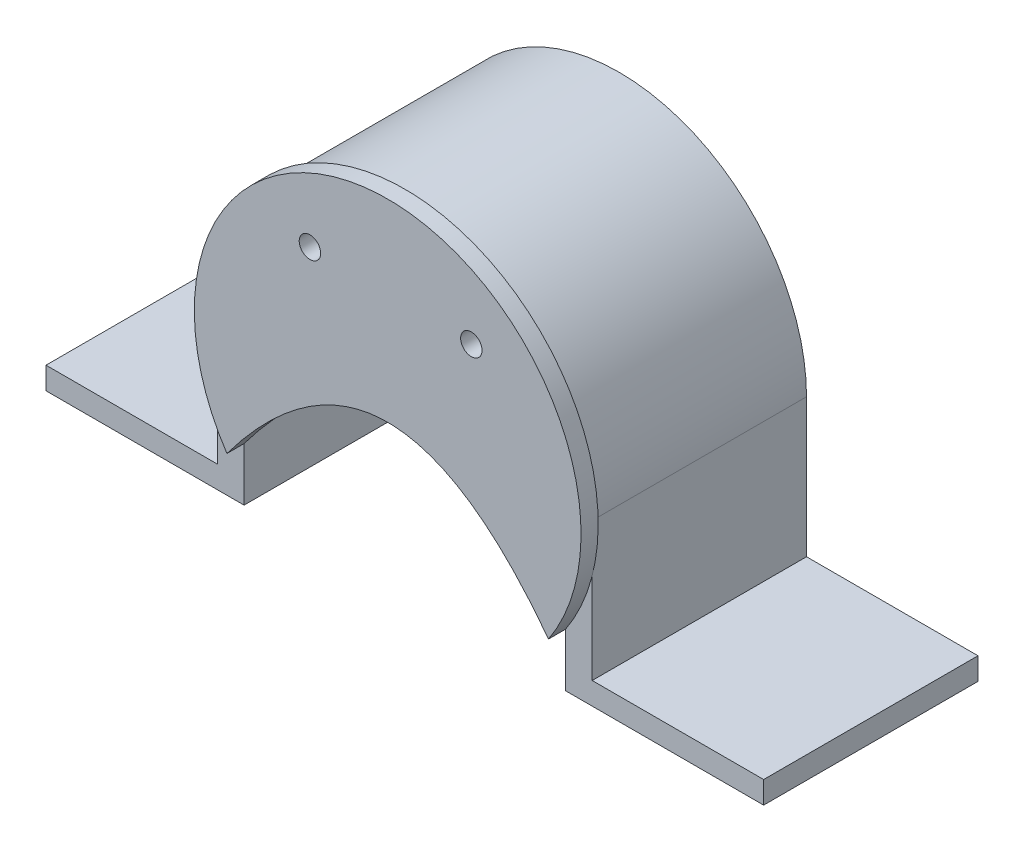
ISO-10303-21;
HEADER;
FILE_DESCRIPTION(('STEP AP214'),'2;1');
FILE_NAME('part.step','',(''),(''),'','','');
FILE_SCHEMA(('AUTOMOTIVE_DESIGN { 1 0 10303 214 1 1 1 1 }'));
ENDSEC;
DATA;
#1=APPLICATION_CONTEXT('core data for automotive mechanical design processes');
#2=APPLICATION_PROTOCOL_DEFINITION('international standard','automotive_design',2000,#1);
#3=PRODUCT_CONTEXT('',#1,'mechanical');
#4=PRODUCT('Part','Part','',(#3));
#5=PRODUCT_RELATED_PRODUCT_CATEGORY('part','',(#4));
#6=PRODUCT_DEFINITION_FORMATION('','',#4);
#7=PRODUCT_DEFINITION_CONTEXT('part definition',#1,'design');
#8=PRODUCT_DEFINITION('design','',#6,#7);
#9=PRODUCT_DEFINITION_SHAPE('','',#8);
#10=(LENGTH_UNIT() NAMED_UNIT(*) SI_UNIT(.MILLI.,.METRE.));
#11=(NAMED_UNIT(*) PLANE_ANGLE_UNIT() SI_UNIT($,.RADIAN.));
#12=(NAMED_UNIT(*) SI_UNIT($,.STERADIAN.) SOLID_ANGLE_UNIT());
#13=UNCERTAINTY_MEASURE_WITH_UNIT(LENGTH_MEASURE(1.E-05),#10,'distance_accuracy_value','');
#14=(GEOMETRIC_REPRESENTATION_CONTEXT(3) GLOBAL_UNCERTAINTY_ASSIGNED_CONTEXT((#13)) GLOBAL_UNIT_ASSIGNED_CONTEXT((#10,
#11,#12)) REPRESENTATION_CONTEXT('',''));
#15=CARTESIAN_POINT('',(0.,0.,0.));
#16=DIRECTION('',(0.,0.,1.));
#17=DIRECTION('',(1.,0.,0.));
#18=AXIS2_PLACEMENT_3D('',#15,#16,#17);
#19=CARTESIAN_POINT('',(0.,0.,27.));
#20=DIRECTION('',(0.,0.,1.));
#21=DIRECTION('',(1.,0.,0.));
#22=AXIS2_PLACEMENT_3D('',#19,#20,#21);
#23=PLANE('',#22);
#24=CARTESIAN_POINT('',(9.75643604418349,12.7516974651583,27.));
#25=DIRECTION('',(0.,0.,1.));
#26=DIRECTION('',(1.,0.,0.));
#27=AXIS2_PLACEMENT_3D('',#24,#25,#26);
#28=CIRCLE('',#27,1.25);
#29=CARTESIAN_POINT('',(11.0064360441835,12.7516974651583,27.));
#30=VERTEX_POINT('',#29);
#31=EDGE_CURVE('E95',#30,#30,#28,.T.);
#32=ORIENTED_EDGE('',*,*,#31,.F.);
#33=EDGE_LOOP('',(#32));
#34=FACE_BOUND('',#33,.T.);
#35=CARTESIAN_POINT('',(-18.75,-12.5308279566545,27.));
#36=CARTESIAN_POINT('',(0.,12.5308279566545,27.));
#37=CARTESIAN_POINT('',(18.75,-12.5308279566545,27.));
#38=B_SPLINE_CURVE_WITH_KNOTS('',2,(#35,#36,#37),.UNSPECIFIED.,.F.,.F.,(3,3),(0.,1.),.UNSPECIFIED.);
#39=CARTESIAN_POINT('',(-18.75,-12.5308279566545,27.));
#40=VERTEX_POINT('',#39);
#41=CARTESIAN_POINT('',(18.75,-12.5308279566545,27.));
#42=VERTEX_POINT('',#41);
#43=EDGE_CURVE('E89',#40,#42,#38,.T.);
#44=ORIENTED_EDGE('',*,*,#43,.T.);
#45=CARTESIAN_POINT('',(0.,0.,27.));
#46=DIRECTION('',(0.,0.,1.));
#47=DIRECTION('',(1.,0.,0.));
#48=AXIS2_PLACEMENT_3D('',#45,#46,#47);
#49=CIRCLE('',#48,22.5518103326379);
#50=EDGE_CURVE('E74',#42,#40,#49,.T.);
#51=ORIENTED_EDGE('',*,*,#50,.T.);
#52=EDGE_LOOP('',(#44,#51));
#53=FACE_BOUND('',#52,.T.);
#54=CARTESIAN_POINT('',(-9.06692483850526,13.1519887269306,27.));
#55=DIRECTION('',(0.,0.,1.));
#56=DIRECTION('',(1.,0.,0.));
#57=AXIS2_PLACEMENT_3D('',#54,#55,#56);
#58=CIRCLE('',#57,1.25);
#59=CARTESIAN_POINT('',(-7.81692483850526,13.1519887269306,27.));
#60=VERTEX_POINT('',#59);
#61=EDGE_CURVE('E114',#60,#60,#58,.T.);
#62=ORIENTED_EDGE('',*,*,#61,.F.);
#63=EDGE_LOOP('',(#62));
#64=FACE_BOUND('',#63,.T.);
#65=ADVANCED_FACE('F57',(#34,#53,#64),#23,.T.);
#66=CARTESIAN_POINT('',(0.,0.,25.));
#67=DIRECTION('',(0.,0.,1.));
#68=DIRECTION('',(1.,0.,0.));
#69=AXIS2_PLACEMENT_3D('',#66,#67,#68);
#70=PLANE('',#69);
#71=CARTESIAN_POINT('',(-18.75,-12.5308279566545,25.));
#72=CARTESIAN_POINT('',(0.,12.5308279566545,25.));
#73=CARTESIAN_POINT('',(18.75,-12.5308279566545,25.));
#74=B_SPLINE_CURVE_WITH_KNOTS('',2,(#71,#72,#73),.UNSPECIFIED.,.F.,.F.,(3,3),(0.,1.),.UNSPECIFIED.);
#75=CARTESIAN_POINT('',(-18.75,-12.5308279566545,25.));
#76=VERTEX_POINT('',#75);
#77=CARTESIAN_POINT('',(18.75,-12.5308279566545,25.));
#78=VERTEX_POINT('',#77);
#79=EDGE_CURVE('E90',#76,#78,#74,.T.);
#80=ORIENTED_EDGE('',*,*,#79,.F.);
#81=CARTESIAN_POINT('',(0.,0.,25.));
#82=DIRECTION('',(0.,0.,1.));
#83=DIRECTION('',(1.,0.,0.));
#84=AXIS2_PLACEMENT_3D('',#81,#82,#83);
#85=CIRCLE('',#84,22.5518103326379);
#86=EDGE_CURVE('E82',#78,#76,#85,.T.);
#87=ORIENTED_EDGE('',*,*,#86,.F.);
#88=EDGE_LOOP('',(#80,#87));
#89=FACE_BOUND('',#88,.T.);
#90=CARTESIAN_POINT('',(9.75643604418349,12.7516974651583,25.));
#91=DIRECTION('',(0.,0.,1.));
#92=DIRECTION('',(1.,0.,0.));
#93=AXIS2_PLACEMENT_3D('',#90,#91,#92);
#94=CIRCLE('',#93,1.25);
#95=CARTESIAN_POINT('',(11.0064360441835,12.7516974651583,25.));
#96=VERTEX_POINT('',#95);
#97=EDGE_CURVE('E98',#96,#96,#94,.T.);
#98=ORIENTED_EDGE('',*,*,#97,.T.);
#99=EDGE_LOOP('',(#98));
#100=FACE_BOUND('',#99,.T.);
#101=CARTESIAN_POINT('',(-9.06692483850526,13.1519887269306,25.));
#102=DIRECTION('',(0.,0.,1.));
#103=DIRECTION('',(1.,0.,0.));
#104=AXIS2_PLACEMENT_3D('',#101,#102,#103);
#105=CIRCLE('',#104,1.25);
#106=CARTESIAN_POINT('',(-7.81692483850526,13.1519887269306,25.));
#107=VERTEX_POINT('',#106);
#108=EDGE_CURVE('E116',#107,#107,#105,.T.);
#109=ORIENTED_EDGE('',*,*,#108,.T.);
#110=EDGE_LOOP('',(#109));
#111=FACE_BOUND('',#110,.T.);
#112=ADVANCED_FACE('F93',(#89,#100,#111),#70,.F.);
#113=DIRECTION('',(0.,0.,-1.));
#114=VECTOR('',#113,1.);
#115=SURFACE_OF_LINEAR_EXTRUSION('',#38,#114);
#116=ORIENTED_EDGE('',*,*,#79,.T.);
#117=DIRECTION('',(0.,0.,-1.));
#118=VECTOR('',#117,1.);
#119=CARTESIAN_POINT('',(18.75,-12.5308279566545,27.));
#120=LINE('',#119,#118);
#121=EDGE_CURVE('E12',#42,#78,#120,.T.);
#122=ORIENTED_EDGE('',*,*,#121,.F.);
#123=ORIENTED_EDGE('',*,*,#43,.F.);
#124=DIRECTION('',(0.,0.,-1.));
#125=VECTOR('',#124,1.);
#126=CARTESIAN_POINT('',(-18.75,-12.5308279566545,27.));
#127=LINE('',#126,#125);
#128=EDGE_CURVE('E67',#40,#76,#127,.T.);
#129=ORIENTED_EDGE('',*,*,#128,.T.);
#130=EDGE_LOOP('',(#116,#122,#123,#129));
#131=FACE_BOUND('',#130,.T.);
#132=ADVANCED_FACE('F59',(#131),#115,.F.);
#133=CARTESIAN_POINT('',(0.,0.,27.));
#134=DIRECTION('',(0.,0.,-1.));
#135=DIRECTION('',(-1.,0.,0.));
#136=AXIS2_PLACEMENT_3D('',#133,#134,#135);
#137=CYLINDRICAL_SURFACE('',#136,22.5518103326379);
#138=ORIENTED_EDGE('',*,*,#86,.T.);
#139=ORIENTED_EDGE('',*,*,#128,.F.);
#140=ORIENTED_EDGE('',*,*,#50,.F.);
#141=ORIENTED_EDGE('',*,*,#121,.T.);
#142=EDGE_LOOP('',(#138,#139,#140,#141));
#143=FACE_BOUND('',#142,.T.);
#144=ADVANCED_FACE('F85',(#143),#137,.T.);
#145=CARTESIAN_POINT('',(9.75643604418349,12.7516974651583,27.));
#146=DIRECTION('',(0.,0.,-1.));
#147=DIRECTION('',(-1.,0.,0.));
#148=AXIS2_PLACEMENT_3D('',#145,#146,#147);
#149=CYLINDRICAL_SURFACE('',#148,1.25);
#150=ORIENTED_EDGE('',*,*,#31,.T.);
#151=EDGE_LOOP('',(#150));
#152=FACE_BOUND('',#151,.T.);
#153=ORIENTED_EDGE('',*,*,#97,.F.);
#154=EDGE_LOOP('',(#153));
#155=FACE_BOUND('',#154,.T.);
#156=ADVANCED_FACE('F134',(#152,#155),#149,.F.);
#157=CARTESIAN_POINT('',(-9.06692483850526,13.1519887269306,27.));
#158=DIRECTION('',(0.,0.,-1.));
#159=DIRECTION('',(-1.,0.,0.));
#160=AXIS2_PLACEMENT_3D('',#157,#158,#159);
#161=CYLINDRICAL_SURFACE('',#160,1.25);
#162=ORIENTED_EDGE('',*,*,#61,.T.);
#163=EDGE_LOOP('',(#162));
#164=FACE_BOUND('',#163,.T.);
#165=ORIENTED_EDGE('',*,*,#108,.F.);
#166=EDGE_LOOP('',(#165));
#167=FACE_BOUND('',#166,.T.);
#168=ADVANCED_FACE('F122',(#164,#167),#161,.F.);
#169=CLOSED_SHELL('',(#65,#112,#132,#144,#156,#168));
#170=MANIFOLD_SOLID_BREP('B2',#169);
#171=CARTESIAN_POINT('',(0.,0.,25.));
#172=DIRECTION('',(0.,0.,-1.));
#173=DIRECTION('',(-1.,0.,0.));
#174=AXIS2_PLACEMENT_3D('',#171,#172,#173);
#175=CYLINDRICAL_SURFACE('',#174,18.75);
#176=CARTESIAN_POINT('',(0.,0.,0.));
#177=DIRECTION('',(0.,0.,-1.));
#178=DIRECTION('',(1.,0.,0.));
#179=AXIS2_PLACEMENT_3D('',#176,#177,#178);
#180=CIRCLE('',#179,18.75);
#181=CARTESIAN_POINT('',(-18.75,0.,0.));
#182=VERTEX_POINT('',#181);
#183=CARTESIAN_POINT('',(18.75,0.,0.));
#184=VERTEX_POINT('',#183);
#185=EDGE_CURVE('E307',#182,#184,#180,.T.);
#186=ORIENTED_EDGE('',*,*,#185,.T.);
#187=DIRECTION('',(0.,0.,-1.));
#188=VECTOR('',#187,1.);
#189=CARTESIAN_POINT('',(18.75,0.,25.));
#190=LINE('',#189,#188);
#191=CARTESIAN_POINT('',(18.75,0.,25.));
#192=VERTEX_POINT('',#191);
#193=EDGE_CURVE('E55',#192,#184,#190,.T.);
#194=ORIENTED_EDGE('',*,*,#193,.F.);
#195=CARTESIAN_POINT('',(0.,0.,25.));
#196=DIRECTION('',(0.,0.,-1.));
#197=DIRECTION('',(1.,0.,0.));
#198=AXIS2_PLACEMENT_3D('',#195,#196,#197);
#199=CIRCLE('',#198,18.75);
#200=CARTESIAN_POINT('',(-18.75,0.,25.));
#201=VERTEX_POINT('',#200);
#202=EDGE_CURVE('E342',#201,#192,#199,.T.);
#203=ORIENTED_EDGE('',*,*,#202,.F.);
#204=DIRECTION('',(0.,0.,-1.));
#205=VECTOR('',#204,1.);
#206=CARTESIAN_POINT('',(-18.75,0.,25.));
#207=LINE('',#206,#205);
#208=EDGE_CURVE('E303',#201,#182,#207,.T.);
#209=ORIENTED_EDGE('',*,*,#208,.T.);
#210=EDGE_LOOP('',(#186,#194,#203,#209));
#211=FACE_BOUND('',#210,.T.);
#212=ADVANCED_FACE('F182',(#211),#175,.F.);
#213=CARTESIAN_POINT('',(18.75,0.,25.));
#214=DIRECTION('',(1.,0.,0.));
#215=DIRECTION('',(0.,0.,-1.));
#216=AXIS2_PLACEMENT_3D('',#213,#214,#215);
#217=PLANE('',#216);
#218=DIRECTION('',(0.,-1.,0.));
#219=VECTOR('',#218,1.);
#220=CARTESIAN_POINT('',(18.75,0.,0.));
#221=LINE('',#220,#219);
#222=CARTESIAN_POINT('',(18.75,-18.75,0.));
#223=VERTEX_POINT('',#222);
#224=EDGE_CURVE('E311',#184,#223,#221,.T.);
#225=ORIENTED_EDGE('',*,*,#224,.T.);
#226=DIRECTION('',(0.,0.,-1.));
#227=VECTOR('',#226,1.);
#228=CARTESIAN_POINT('',(18.75,-18.75,25.));
#229=LINE('',#228,#227);
#230=CARTESIAN_POINT('',(18.75,-18.75,25.));
#231=VERTEX_POINT('',#230);
#232=EDGE_CURVE('E191',#231,#223,#229,.T.);
#233=ORIENTED_EDGE('',*,*,#232,.F.);
#234=DIRECTION('',(0.,-1.,0.));
#235=VECTOR('',#234,1.);
#236=CARTESIAN_POINT('',(18.75,0.,25.));
#237=LINE('',#236,#235);
#238=EDGE_CURVE('E254',#192,#231,#237,.T.);
#239=ORIENTED_EDGE('',*,*,#238,.F.);
#240=ORIENTED_EDGE('',*,*,#193,.T.);
#241=EDGE_LOOP('',(#225,#233,#239,#240));
#242=FACE_BOUND('',#241,.T.);
#243=ADVANCED_FACE('F379',(#242),#217,.F.);
#244=CARTESIAN_POINT('',(41.8510494945621,-18.75,25.));
#245=DIRECTION('',(0.,1.,0.));
#246=DIRECTION('',(0.,0.,1.));
#247=AXIS2_PLACEMENT_3D('',#244,#245,#246);
#248=PLANE('',#247);
#249=DIRECTION('',(1.,0.,0.));
#250=VECTOR('',#249,1.);
#251=CARTESIAN_POINT('',(41.8510494945621,-18.75,0.));
#252=LINE('',#251,#250);
#253=CARTESIAN_POINT('',(41.8510494945621,-18.75,0.));
#254=VERTEX_POINT('',#253);
#255=EDGE_CURVE('E315',#223,#254,#252,.T.);
#256=ORIENTED_EDGE('',*,*,#255,.T.);
#257=DIRECTION('',(0.,0.,-1.));
#258=VECTOR('',#257,1.);
#259=CARTESIAN_POINT('',(41.8510494945621,-18.75,25.));
#260=LINE('',#259,#258);
#261=CARTESIAN_POINT('',(41.8510494945621,-18.75,25.));
#262=VERTEX_POINT('',#261);
#263=EDGE_CURVE('E369',#262,#254,#260,.T.);
#264=ORIENTED_EDGE('',*,*,#263,.F.);
#265=DIRECTION('',(1.,0.,0.));
#266=VECTOR('',#265,1.);
#267=CARTESIAN_POINT('',(18.75,-18.75,25.));
#268=LINE('',#267,#266);
#269=EDGE_CURVE('E378',#231,#262,#268,.T.);
#270=ORIENTED_EDGE('',*,*,#269,.F.);
#271=ORIENTED_EDGE('',*,*,#232,.T.);
#272=EDGE_LOOP('',(#256,#264,#270,#271));
#273=FACE_BOUND('',#272,.T.);
#274=ADVANCED_FACE('F376',(#273),#248,.F.);
#275=CARTESIAN_POINT('',(41.8510494945621,-16.1603881879005,25.));
#276=DIRECTION('',(-1.,0.,0.));
#277=DIRECTION('',(0.,0.,1.));
#278=AXIS2_PLACEMENT_3D('',#275,#276,#277);
#279=PLANE('',#278);
#280=DIRECTION('',(0.,1.,0.));
#281=VECTOR('',#280,1.);
#282=CARTESIAN_POINT('',(41.8510494945621,-16.1603881879005,0.));
#283=LINE('',#282,#281);
#284=CARTESIAN_POINT('',(41.8510494945621,-16.1603881879005,0.));
#285=VERTEX_POINT('',#284);
#286=EDGE_CURVE('E318',#254,#285,#283,.T.);
#287=ORIENTED_EDGE('',*,*,#286,.T.);
#288=DIRECTION('',(0.,0.,-1.));
#289=VECTOR('',#288,1.);
#290=CARTESIAN_POINT('',(41.8510494945621,-16.1603881879005,25.));
#291=LINE('',#290,#289);
#292=CARTESIAN_POINT('',(41.8510494945621,-16.1603881879005,25.));
#293=VERTEX_POINT('',#292);
#294=EDGE_CURVE('E365',#293,#285,#291,.T.);
#295=ORIENTED_EDGE('',*,*,#294,.F.);
#296=DIRECTION('',(0.,1.,0.));
#297=VECTOR('',#296,1.);
#298=CARTESIAN_POINT('',(41.8510494945621,-16.1603881879005,25.));
#299=LINE('',#298,#297);
#300=EDGE_CURVE('E399',#262,#293,#299,.T.);
#301=ORIENTED_EDGE('',*,*,#300,.F.);
#302=ORIENTED_EDGE('',*,*,#263,.T.);
#303=EDGE_LOOP('',(#287,#295,#301,#302));
#304=FACE_BOUND('',#303,.T.);
#305=ADVANCED_FACE('F389',(#304),#279,.F.);
#306=CARTESIAN_POINT('',(21.8510494945621,-16.1603881879005,25.));
#307=DIRECTION('',(0.,-1.,0.));
#308=DIRECTION('',(0.,0.,-1.));
#309=AXIS2_PLACEMENT_3D('',#306,#307,#308);
#310=PLANE('',#309);
#311=DIRECTION('',(-1.,0.,0.));
#312=VECTOR('',#311,1.);
#313=CARTESIAN_POINT('',(21.8510494945621,-16.1603881879005,0.));
#314=LINE('',#313,#312);
#315=CARTESIAN_POINT('',(21.8510494945621,-16.1603881879005,0.));
#316=VERTEX_POINT('',#315);
#317=EDGE_CURVE('E321',#285,#316,#314,.T.);
#318=ORIENTED_EDGE('',*,*,#317,.T.);
#319=DIRECTION('',(0.,0.,-1.));
#320=VECTOR('',#319,1.);
#321=CARTESIAN_POINT('',(21.8510494945621,-16.1603881879005,25.));
#322=LINE('',#321,#320);
#323=CARTESIAN_POINT('',(21.8510494945621,-16.1603881879005,25.));
#324=VERTEX_POINT('',#323);
#325=EDGE_CURVE('E361',#324,#316,#322,.T.);
#326=ORIENTED_EDGE('',*,*,#325,.F.);
#327=DIRECTION('',(-1.,0.,0.));
#328=VECTOR('',#327,1.);
#329=CARTESIAN_POINT('',(21.8510494945621,-16.1603881879005,25.));
#330=LINE('',#329,#328);
#331=EDGE_CURVE('E395',#293,#324,#330,.T.);
#332=ORIENTED_EDGE('',*,*,#331,.F.);
#333=ORIENTED_EDGE('',*,*,#294,.T.);
#334=EDGE_LOOP('',(#318,#326,#332,#333));
#335=FACE_BOUND('',#334,.T.);
#336=ADVANCED_FACE('F393',(#335),#310,.F.);
#337=CARTESIAN_POINT('',(21.8510494945621,-16.1603881879005,25.));
#338=DIRECTION('',(-1.,0.,0.));
#339=DIRECTION('',(0.,0.,1.));
#340=AXIS2_PLACEMENT_3D('',#337,#338,#339);
#341=PLANE('',#340);
#342=DIRECTION('',(0.,1.,0.));
#343=VECTOR('',#342,1.);
#344=CARTESIAN_POINT('',(21.8510494945621,-16.1603881879005,0.));
#345=LINE('',#344,#343);
#346=CARTESIAN_POINT('',(21.8510494945621,0.,0.));
#347=VERTEX_POINT('',#346);
#348=EDGE_CURVE('E324',#316,#347,#345,.T.);
#349=ORIENTED_EDGE('',*,*,#348,.T.);
#350=DIRECTION('',(0.,0.,-1.));
#351=VECTOR('',#350,1.);
#352=CARTESIAN_POINT('',(21.8510494945621,0.,25.));
#353=LINE('',#352,#351);
#354=CARTESIAN_POINT('',(21.8510494945621,0.,25.));
#355=VERTEX_POINT('',#354);
#356=EDGE_CURVE('E357',#355,#347,#353,.T.);
#357=ORIENTED_EDGE('',*,*,#356,.F.);
#358=DIRECTION('',(0.,1.,0.));
#359=VECTOR('',#358,1.);
#360=CARTESIAN_POINT('',(21.8510494945621,-16.1603881879005,25.));
#361=LINE('',#360,#359);
#362=EDGE_CURVE('E398',#324,#355,#361,.T.);
#363=ORIENTED_EDGE('',*,*,#362,.F.);
#364=ORIENTED_EDGE('',*,*,#325,.T.);
#365=EDGE_LOOP('',(#349,#357,#363,#364));
#366=FACE_BOUND('',#365,.T.);
#367=ADVANCED_FACE('F428',(#366),#341,.F.);
#368=CARTESIAN_POINT('',(0.,0.,25.));
#369=DIRECTION('',(0.,0.,-1.));
#370=DIRECTION('',(-1.,0.,0.));
#371=AXIS2_PLACEMENT_3D('',#368,#369,#370);
#372=CYLINDRICAL_SURFACE('',#371,21.8510494945621);
#373=CARTESIAN_POINT('',(0.,0.,0.));
#374=DIRECTION('',(0.,0.,1.));
#375=DIRECTION('',(1.,0.,0.));
#376=AXIS2_PLACEMENT_3D('',#373,#374,#375);
#377=CIRCLE('',#376,21.8510494945621);
#378=CARTESIAN_POINT('',(-21.8510494945621,0.,0.));
#379=VERTEX_POINT('',#378);
#380=EDGE_CURVE('E327',#347,#379,#377,.T.);
#381=ORIENTED_EDGE('',*,*,#380,.T.);
#382=DIRECTION('',(0.,0.,-1.));
#383=VECTOR('',#382,1.);
#384=CARTESIAN_POINT('',(-21.8510494945621,0.,25.));
#385=LINE('',#384,#383);
#386=CARTESIAN_POINT('',(-21.8510494945621,0.,25.));
#387=VERTEX_POINT('',#386);
#388=EDGE_CURVE('E353',#387,#379,#385,.T.);
#389=ORIENTED_EDGE('',*,*,#388,.F.);
#390=CARTESIAN_POINT('',(0.,0.,25.));
#391=DIRECTION('',(0.,0.,1.));
#392=DIRECTION('',(1.,0.,0.));
#393=AXIS2_PLACEMENT_3D('',#390,#391,#392);
#394=CIRCLE('',#393,21.8510494945621);
#395=EDGE_CURVE('E403',#355,#387,#394,.T.);
#396=ORIENTED_EDGE('',*,*,#395,.F.);
#397=ORIENTED_EDGE('',*,*,#356,.T.);
#398=EDGE_LOOP('',(#381,#389,#396,#397));
#399=FACE_BOUND('',#398,.T.);
#400=ADVANCED_FACE('F425',(#399),#372,.T.);
#401=CARTESIAN_POINT('',(-21.8510494945621,0.,25.));
#402=DIRECTION('',(1.,0.,0.));
#403=DIRECTION('',(0.,0.,-1.));
#404=AXIS2_PLACEMENT_3D('',#401,#402,#403);
#405=PLANE('',#404);
#406=DIRECTION('',(0.,-1.,0.));
#407=VECTOR('',#406,1.);
#408=CARTESIAN_POINT('',(-21.8510494945621,0.,0.));
#409=LINE('',#408,#407);
#410=CARTESIAN_POINT('',(-21.8510494945621,-16.1603881879005,0.));
#411=VERTEX_POINT('',#410);
#412=EDGE_CURVE('E330',#379,#411,#409,.T.);
#413=ORIENTED_EDGE('',*,*,#412,.T.);
#414=DIRECTION('',(0.,0.,-1.));
#415=VECTOR('',#414,1.);
#416=CARTESIAN_POINT('',(-21.8510494945621,-16.1603881879005,25.));
#417=LINE('',#416,#415);
#418=CARTESIAN_POINT('',(-21.8510494945621,-16.1603881879005,25.));
#419=VERTEX_POINT('',#418);
#420=EDGE_CURVE('E349',#419,#411,#417,.T.);
#421=ORIENTED_EDGE('',*,*,#420,.F.);
#422=DIRECTION('',(0.,-1.,0.));
#423=VECTOR('',#422,1.);
#424=CARTESIAN_POINT('',(-21.8510494945621,0.,25.));
#425=LINE('',#424,#423);
#426=EDGE_CURVE('E410',#387,#419,#425,.T.);
#427=ORIENTED_EDGE('',*,*,#426,.F.);
#428=ORIENTED_EDGE('',*,*,#388,.T.);
#429=EDGE_LOOP('',(#413,#421,#427,#428));
#430=FACE_BOUND('',#429,.T.);
#431=ADVANCED_FACE('F418',(#430),#405,.F.);
#432=CARTESIAN_POINT('',(-21.8510494945621,-16.1603881879005,25.));
#433=DIRECTION('',(0.,-1.,0.));
#434=DIRECTION('',(1.,0.,0.));
#435=AXIS2_PLACEMENT_3D('',#432,#433,#434);
#436=PLANE('',#435);
#437=DIRECTION('',(-1.,0.,0.));
#438=VECTOR('',#437,1.);
#439=CARTESIAN_POINT('',(-21.8510494945621,-16.1603881879005,0.));
#440=LINE('',#439,#438);
#441=CARTESIAN_POINT('',(-41.8510494945621,-16.1603881879005,0.));
#442=VERTEX_POINT('',#441);
#443=EDGE_CURVE('E333',#411,#442,#440,.T.);
#444=ORIENTED_EDGE('',*,*,#443,.T.);
#445=DIRECTION('',(0.,0.,-1.));
#446=VECTOR('',#445,1.);
#447=CARTESIAN_POINT('',(-41.8510494945621,-16.1603881879005,25.));
#448=LINE('',#447,#446);
#449=CARTESIAN_POINT('',(-41.8510494945621,-16.1603881879005,25.));
#450=VERTEX_POINT('',#449);
#451=EDGE_CURVE('E296',#450,#442,#448,.T.);
#452=ORIENTED_EDGE('',*,*,#451,.F.);
#453=DIRECTION('',(-1.,0.,0.));
#454=VECTOR('',#453,1.);
#455=CARTESIAN_POINT('',(-21.8510494945621,-16.1603881879005,25.));
#456=LINE('',#455,#454);
#457=EDGE_CURVE('E285',#419,#450,#456,.T.);
#458=ORIENTED_EDGE('',*,*,#457,.F.);
#459=ORIENTED_EDGE('',*,*,#420,.T.);
#460=EDGE_LOOP('',(#444,#452,#458,#459));
#461=FACE_BOUND('',#460,.T.);
#462=ADVANCED_FACE('F422',(#461),#436,.F.);
#463=CARTESIAN_POINT('',(-41.8510494945621,-16.1603881879005,25.));
#464=DIRECTION('',(1.,0.,0.));
#465=DIRECTION('',(0.,0.,-1.));
#466=AXIS2_PLACEMENT_3D('',#463,#464,#465);
#467=PLANE('',#466);
#468=DIRECTION('',(0.,-1.,0.));
#469=VECTOR('',#468,1.);
#470=CARTESIAN_POINT('',(-41.8510494945621,-16.1603881879005,0.));
#471=LINE('',#470,#469);
#472=CARTESIAN_POINT('',(-41.8510494945621,-18.75,0.));
#473=VERTEX_POINT('',#472);
#474=EDGE_CURVE('E294',#442,#473,#471,.T.);
#475=ORIENTED_EDGE('',*,*,#474,.T.);
#476=DIRECTION('',(0.,0.,-1.));
#477=VECTOR('',#476,1.);
#478=CARTESIAN_POINT('',(-41.8510494945621,-18.75,25.));
#479=LINE('',#478,#477);
#480=CARTESIAN_POINT('',(-41.8510494945621,-18.75,25.));
#481=VERTEX_POINT('',#480);
#482=EDGE_CURVE('E291',#481,#473,#479,.T.);
#483=ORIENTED_EDGE('',*,*,#482,.F.);
#484=DIRECTION('',(0.,-1.,0.));
#485=VECTOR('',#484,1.);
#486=CARTESIAN_POINT('',(-41.8510494945621,-16.1603881879005,25.));
#487=LINE('',#486,#485);
#488=EDGE_CURVE('E279',#450,#481,#487,.T.);
#489=ORIENTED_EDGE('',*,*,#488,.F.);
#490=ORIENTED_EDGE('',*,*,#451,.T.);
#491=EDGE_LOOP('',(#475,#483,#489,#490));
#492=FACE_BOUND('',#491,.T.);
#493=ADVANCED_FACE('F292',(#492),#467,.F.);
#494=CARTESIAN_POINT('',(-18.75,-18.75,25.));
#495=DIRECTION('',(0.,1.,0.));
#496=DIRECTION('',(-1.,0.,0.));
#497=AXIS2_PLACEMENT_3D('',#494,#495,#496);
#498=PLANE('',#497);
#499=DIRECTION('',(1.,0.,0.));
#500=VECTOR('',#499,1.);
#501=CARTESIAN_POINT('',(-18.75,-18.75,0.));
#502=LINE('',#501,#500);
#503=CARTESIAN_POINT('',(-18.75,-18.75,0.));
#504=VERTEX_POINT('',#503);
#505=EDGE_CURVE('E240',#473,#504,#502,.T.);
#506=ORIENTED_EDGE('',*,*,#505,.T.);
#507=DIRECTION('',(0.,0.,-1.));
#508=VECTOR('',#507,1.);
#509=CARTESIAN_POINT('',(-18.75,-18.75,25.));
#510=LINE('',#509,#508);
#511=CARTESIAN_POINT('',(-18.75,-18.75,25.));
#512=VERTEX_POINT('',#511);
#513=EDGE_CURVE('E297',#512,#504,#510,.T.);
#514=ORIENTED_EDGE('',*,*,#513,.F.);
#515=DIRECTION('',(1.,0.,0.));
#516=VECTOR('',#515,1.);
#517=CARTESIAN_POINT('',(-18.75,-18.75,25.));
#518=LINE('',#517,#516);
#519=EDGE_CURVE('E283',#481,#512,#518,.T.);
#520=ORIENTED_EDGE('',*,*,#519,.F.);
#521=ORIENTED_EDGE('',*,*,#482,.T.);
#522=EDGE_LOOP('',(#506,#514,#520,#521));
#523=FACE_BOUND('',#522,.T.);
#524=ADVANCED_FACE('F299',(#523),#498,.F.);
#525=CARTESIAN_POINT('',(-18.75,0.,25.));
#526=DIRECTION('',(-1.,0.,0.));
#527=DIRECTION('',(0.,0.,1.));
#528=AXIS2_PLACEMENT_3D('',#525,#526,#527);
#529=PLANE('',#528);
#530=DIRECTION('',(0.,1.,0.));
#531=VECTOR('',#530,1.);
#532=CARTESIAN_POINT('',(-18.75,0.,0.));
#533=LINE('',#532,#531);
#534=EDGE_CURVE('E246',#504,#182,#533,.T.);
#535=ORIENTED_EDGE('',*,*,#534,.T.);
#536=ORIENTED_EDGE('',*,*,#208,.F.);
#537=DIRECTION('',(0.,1.,0.));
#538=VECTOR('',#537,1.);
#539=CARTESIAN_POINT('',(-18.75,0.,25.));
#540=LINE('',#539,#538);
#541=EDGE_CURVE('E199',#512,#201,#540,.T.);
#542=ORIENTED_EDGE('',*,*,#541,.F.);
#543=ORIENTED_EDGE('',*,*,#513,.T.);
#544=EDGE_LOOP('',(#535,#536,#542,#543));
#545=FACE_BOUND('',#544,.T.);
#546=ADVANCED_FACE('F443',(#545),#529,.F.);
#547=CARTESIAN_POINT('',(0.,0.,25.));
#548=DIRECTION('',(0.,0.,1.));
#549=DIRECTION('',(1.,0.,0.));
#550=AXIS2_PLACEMENT_3D('',#547,#548,#549);
#551=PLANE('',#550);
#552=ORIENTED_EDGE('',*,*,#202,.T.);
#553=ORIENTED_EDGE('',*,*,#238,.T.);
#554=ORIENTED_EDGE('',*,*,#269,.T.);
#555=ORIENTED_EDGE('',*,*,#300,.T.);
#556=ORIENTED_EDGE('',*,*,#331,.T.);
#557=ORIENTED_EDGE('',*,*,#362,.T.);
#558=ORIENTED_EDGE('',*,*,#395,.T.);
#559=ORIENTED_EDGE('',*,*,#426,.T.);
#560=ORIENTED_EDGE('',*,*,#457,.T.);
#561=ORIENTED_EDGE('',*,*,#488,.T.);
#562=ORIENTED_EDGE('',*,*,#519,.T.);
#563=ORIENTED_EDGE('',*,*,#541,.T.);
#564=EDGE_LOOP('',(#552,#553,#554,#555,#556,#557,#558,#559,#560,#561,#562,#563));
#565=FACE_BOUND('',#564,.T.);
#566=ADVANCED_FACE('F281',(#565),#551,.T.);
#567=CARTESIAN_POINT('',(0.,0.,0.));
#568=DIRECTION('',(0.,0.,1.));
#569=DIRECTION('',(1.,0.,0.));
#570=AXIS2_PLACEMENT_3D('',#567,#568,#569);
#571=PLANE('',#570);
#572=ORIENTED_EDGE('',*,*,#185,.F.);
#573=ORIENTED_EDGE('',*,*,#534,.F.);
#574=ORIENTED_EDGE('',*,*,#505,.F.);
#575=ORIENTED_EDGE('',*,*,#474,.F.);
#576=ORIENTED_EDGE('',*,*,#443,.F.);
#577=ORIENTED_EDGE('',*,*,#412,.F.);
#578=ORIENTED_EDGE('',*,*,#380,.F.);
#579=ORIENTED_EDGE('',*,*,#348,.F.);
#580=ORIENTED_EDGE('',*,*,#317,.F.);
#581=ORIENTED_EDGE('',*,*,#286,.F.);
#582=ORIENTED_EDGE('',*,*,#255,.F.);
#583=ORIENTED_EDGE('',*,*,#224,.F.);
#584=EDGE_LOOP('',(#572,#573,#574,#575,#576,#577,#578,#579,#580,#581,#582,#583));
#585=FACE_BOUND('',#584,.T.);
#586=ADVANCED_FACE('F383',(#585),#571,.F.);
#587=CLOSED_SHELL('',(#212,#243,#274,#305,#336,#367,#400,#431,#462,#493,#524,#546,#566,#586));
#588=MANIFOLD_SOLID_BREP('B6',#587);
#589=ADVANCED_BREP_SHAPE_REPRESENTATION('',(#18,#170,#588),#14);
#590=SHAPE_DEFINITION_REPRESENTATION(#9,#589);
ENDSEC;
END-ISO-10303-21;
